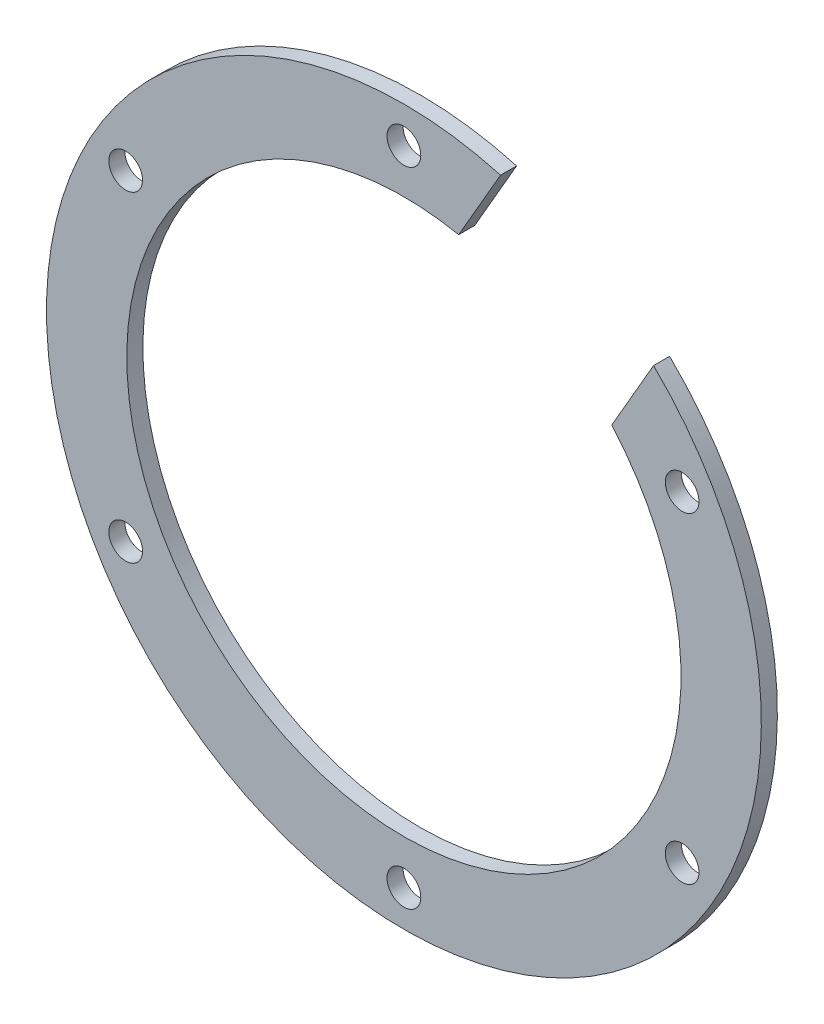
ISO-10303-21;
HEADER;
FILE_DESCRIPTION(('STEP AP214'),'2;1');
FILE_NAME('part.step','',(''),(''),'','','');
FILE_SCHEMA(('AUTOMOTIVE_DESIGN { 1 0 10303 214 1 1 1 1 }'));
ENDSEC;
DATA;
#1=APPLICATION_CONTEXT('core data for automotive mechanical design processes');
#2=APPLICATION_PROTOCOL_DEFINITION('international standard','automotive_design',2000,#1);
#3=PRODUCT_CONTEXT('',#1,'mechanical');
#4=PRODUCT('Part','Part','',(#3));
#5=PRODUCT_RELATED_PRODUCT_CATEGORY('part','',(#4));
#6=PRODUCT_DEFINITION_FORMATION('','',#4);
#7=PRODUCT_DEFINITION_CONTEXT('part definition',#1,'design');
#8=PRODUCT_DEFINITION('design','',#6,#7);
#9=PRODUCT_DEFINITION_SHAPE('','',#8);
#10=(LENGTH_UNIT() NAMED_UNIT(*) SI_UNIT(.MILLI.,.METRE.));
#11=(NAMED_UNIT(*) PLANE_ANGLE_UNIT() SI_UNIT($,.RADIAN.));
#12=(NAMED_UNIT(*) SI_UNIT($,.STERADIAN.) SOLID_ANGLE_UNIT());
#13=UNCERTAINTY_MEASURE_WITH_UNIT(LENGTH_MEASURE(1.E-05),#10,'distance_accuracy_value','');
#14=(GEOMETRIC_REPRESENTATION_CONTEXT(3) GLOBAL_UNCERTAINTY_ASSIGNED_CONTEXT((#13)) GLOBAL_UNIT_ASSIGNED_CONTEXT((#10,
#11,#12)) REPRESENTATION_CONTEXT('',''));
#15=CARTESIAN_POINT('',(0.,0.,0.));
#16=DIRECTION('',(0.,0.,1.));
#17=DIRECTION('',(1.,0.,0.));
#18=AXIS2_PLACEMENT_3D('',#15,#16,#17);
#19=CARTESIAN_POINT('',(0.,0.,2.));
#20=DIRECTION('',(0.,0.,1.));
#21=DIRECTION('',(1.,0.,0.));
#22=AXIS2_PLACEMENT_3D('',#19,#20,#21);
#23=PLANE('',#22);
#24=DIRECTION('',(-0.499999999999995,-0.866025403784442,0.));
#25=VECTOR('',#24,1.);
#26=CARTESIAN_POINT('',(-6.05603958406258,11.5106317477555,2.));
#27=LINE('',#26,#25);
#28=CARTESIAN_POINT('',(12.0332312207213,42.8421678535139,2.));
#29=VERTEX_POINT('',#28);
#30=CARTESIAN_POINT('',(6.82341474511337,33.8185010196515,2.));
#31=VERTEX_POINT('',#30);
#32=EDGE_CURVE('E56',#29,#31,#27,.T.);
#33=ORIENTED_EDGE('',*,*,#32,.F.);
#34=CARTESIAN_POINT('',(0.,0.,2.));
#35=DIRECTION('',(0.,0.,1.));
#36=DIRECTION('',(1.,0.,0.));
#37=AXIS2_PLACEMENT_3D('',#34,#35,#36);
#38=CIRCLE('',#37,44.5);
#39=CARTESIAN_POINT('',(31.085790103979,31.842167853514,2.));
#40=VERTEX_POINT('',#39);
#41=EDGE_CURVE('E79',#29,#40,#38,.T.);
#42=ORIENTED_EDGE('',*,*,#41,.T.);
#43=DIRECTION('',(0.499999999999995,0.866025403784442,0.));
#44=VECTOR('',#43,1.);
#45=CARTESIAN_POINT('',(12.9965192991951,0.510631747755618,2.));
#46=LINE('',#45,#44);
#47=CARTESIAN_POINT('',(25.8759736283711,22.8185010196516,2.));
#48=VERTEX_POINT('',#47);
#49=EDGE_CURVE('E73',#48,#40,#46,.T.);
#50=ORIENTED_EDGE('',*,*,#49,.F.);
#51=CARTESIAN_POINT('',(0.,0.,2.));
#52=DIRECTION('',(0.,0.,1.));
#53=DIRECTION('',(1.,0.,0.));
#54=AXIS2_PLACEMENT_3D('',#51,#52,#53);
#55=CIRCLE('',#54,34.5);
#56=EDGE_CURVE('E84',#31,#48,#55,.T.);
#57=ORIENTED_EDGE('',*,*,#56,.F.);
#58=EDGE_LOOP('',(#33,#42,#50,#57));
#59=FACE_BOUND('',#58,.T.);
#60=CARTESIAN_POINT('',(0.,40.,2.));
#61=DIRECTION('',(0.,0.,1.));
#62=DIRECTION('',(1.,0.,0.));
#63=AXIS2_PLACEMENT_3D('',#60,#61,#62);
#64=CIRCLE('',#63,2.1);
#65=CARTESIAN_POINT('',(2.1,40.,2.));
#66=VERTEX_POINT('',#65);
#67=EDGE_CURVE('E104',#66,#66,#64,.T.);
#68=ORIENTED_EDGE('',*,*,#67,.F.);
#69=EDGE_LOOP('',(#68));
#70=FACE_BOUND('',#69,.T.);
#71=CARTESIAN_POINT('',(-34.6410161513767,19.9999999999985,2.));
#72=DIRECTION('',(0.,0.,1.));
#73=DIRECTION('',(1.,0.,0.));
#74=AXIS2_PLACEMENT_3D('',#71,#72,#73);
#75=CIRCLE('',#74,2.10000000000172);
#76=CARTESIAN_POINT('',(-32.541016151375,19.9999999999985,2.));
#77=VERTEX_POINT('',#76);
#78=EDGE_CURVE('E175',#77,#77,#75,.T.);
#79=ORIENTED_EDGE('',*,*,#78,.F.);
#80=EDGE_LOOP('',(#79));
#81=FACE_BOUND('',#80,.T.);
#82=CARTESIAN_POINT('',(-34.641016151375,-20.0000000000015,2.));
#83=DIRECTION('',(0.,0.,1.));
#84=DIRECTION('',(1.,0.,0.));
#85=AXIS2_PLACEMENT_3D('',#82,#83,#84);
#86=CIRCLE('',#85,2.10000000000322);
#87=CARTESIAN_POINT('',(-32.5410161513718,-20.0000000000015,2.));
#88=VERTEX_POINT('',#87);
#89=EDGE_CURVE('E96',#88,#88,#86,.T.);
#90=ORIENTED_EDGE('',*,*,#89,.F.);
#91=EDGE_LOOP('',(#90));
#92=FACE_BOUND('',#91,.T.);
#93=CARTESIAN_POINT('',(3.39590937005871E-12,-40.,2.));
#94=DIRECTION('',(0.,0.,1.));
#95=DIRECTION('',(1.,0.,0.));
#96=AXIS2_PLACEMENT_3D('',#93,#94,#95);
#97=CIRCLE('',#96,2.10000000000351);
#98=CARTESIAN_POINT('',(2.10000000000691,-40.,2.));
#99=VERTEX_POINT('',#98);
#100=EDGE_CURVE('E186',#99,#99,#97,.T.);
#101=ORIENTED_EDGE('',*,*,#100,.F.);
#102=EDGE_LOOP('',(#101));
#103=FACE_BOUND('',#102,.T.);
#104=CARTESIAN_POINT('',(34.6410161513801,-19.9999999999985,2.));
#105=DIRECTION('',(0.,0.,1.));
#106=DIRECTION('',(1.,0.,0.));
#107=AXIS2_PLACEMENT_3D('',#104,#105,#106);
#108=CIRCLE('',#107,2.10000000000219);
#109=CARTESIAN_POINT('',(36.7410161513823,-19.9999999999985,2.));
#110=VERTEX_POINT('',#109);
#111=EDGE_CURVE('E184',#110,#110,#108,.T.);
#112=ORIENTED_EDGE('',*,*,#111,.F.);
#113=EDGE_LOOP('',(#112));
#114=FACE_BOUND('',#113,.T.);
#115=CARTESIAN_POINT('',(34.6410161513784,20.0000000000015,2.));
#116=DIRECTION('',(0.,0.,1.));
#117=DIRECTION('',(1.,0.,0.));
#118=AXIS2_PLACEMENT_3D('',#115,#116,#117);
#119=CIRCLE('',#118,2.10000000000048);
#120=CARTESIAN_POINT('',(36.7410161513789,20.0000000000015,2.));
#121=VERTEX_POINT('',#120);
#122=EDGE_CURVE('E164',#121,#121,#119,.T.);
#123=ORIENTED_EDGE('',*,*,#122,.F.);
#124=EDGE_LOOP('',(#123));
#125=FACE_BOUND('',#124,.T.);
#126=ADVANCED_FACE('F34',(#59,#70,#81,#92,#103,#114,#125),#23,.T.);
#127=CARTESIAN_POINT('',(0.,0.,0.));
#128=DIRECTION('',(0.,0.,1.));
#129=DIRECTION('',(1.,0.,0.));
#130=AXIS2_PLACEMENT_3D('',#127,#128,#129);
#131=PLANE('',#130);
#132=CARTESIAN_POINT('',(0.,40.,0.));
#133=DIRECTION('',(0.,0.,1.));
#134=DIRECTION('',(1.,0.,0.));
#135=AXIS2_PLACEMENT_3D('',#132,#133,#134);
#136=CIRCLE('',#135,2.1);
#137=CARTESIAN_POINT('',(2.1,40.,0.));
#138=VERTEX_POINT('',#137);
#139=EDGE_CURVE('E93',#138,#138,#136,.T.);
#140=ORIENTED_EDGE('',*,*,#139,.T.);
#141=EDGE_LOOP('',(#140));
#142=FACE_BOUND('',#141,.T.);
#143=CARTESIAN_POINT('',(-34.6410161513767,19.9999999999985,0.));
#144=DIRECTION('',(0.,0.,1.));
#145=DIRECTION('',(1.,0.,0.));
#146=AXIS2_PLACEMENT_3D('',#143,#144,#145);
#147=CIRCLE('',#146,2.10000000000172);
#148=CARTESIAN_POINT('',(-32.541016151375,19.9999999999985,0.));
#149=VERTEX_POINT('',#148);
#150=EDGE_CURVE('E113',#149,#149,#147,.T.);
#151=ORIENTED_EDGE('',*,*,#150,.T.);
#152=EDGE_LOOP('',(#151));
#153=FACE_BOUND('',#152,.T.);
#154=CARTESIAN_POINT('',(-34.641016151375,-20.0000000000015,0.));
#155=DIRECTION('',(0.,0.,1.));
#156=DIRECTION('',(1.,0.,0.));
#157=AXIS2_PLACEMENT_3D('',#154,#155,#156);
#158=CIRCLE('',#157,2.10000000000322);
#159=CARTESIAN_POINT('',(-32.5410161513718,-20.0000000000015,0.));
#160=VERTEX_POINT('',#159);
#161=EDGE_CURVE('E110',#160,#160,#158,.T.);
#162=ORIENTED_EDGE('',*,*,#161,.T.);
#163=EDGE_LOOP('',(#162));
#164=FACE_BOUND('',#163,.T.);
#165=CARTESIAN_POINT('',(3.39590937005871E-12,-40.,0.));
#166=DIRECTION('',(0.,0.,1.));
#167=DIRECTION('',(1.,0.,0.));
#168=AXIS2_PLACEMENT_3D('',#165,#166,#167);
#169=CIRCLE('',#168,2.10000000000351);
#170=CARTESIAN_POINT('',(2.10000000000691,-40.,0.));
#171=VERTEX_POINT('',#170);
#172=EDGE_CURVE('E107',#171,#171,#169,.T.);
#173=ORIENTED_EDGE('',*,*,#172,.T.);
#174=EDGE_LOOP('',(#173));
#175=FACE_BOUND('',#174,.T.);
#176=CARTESIAN_POINT('',(34.6410161513801,-19.9999999999985,0.));
#177=DIRECTION('',(0.,0.,1.));
#178=DIRECTION('',(1.,0.,0.));
#179=AXIS2_PLACEMENT_3D('',#176,#177,#178);
#180=CIRCLE('',#179,2.10000000000219);
#181=CARTESIAN_POINT('',(36.7410161513823,-19.9999999999985,0.));
#182=VERTEX_POINT('',#181);
#183=EDGE_CURVE('E103',#182,#182,#180,.T.);
#184=ORIENTED_EDGE('',*,*,#183,.T.);
#185=EDGE_LOOP('',(#184));
#186=FACE_BOUND('',#185,.T.);
#187=CARTESIAN_POINT('',(34.6410161513784,20.0000000000015,0.));
#188=DIRECTION('',(0.,0.,1.));
#189=DIRECTION('',(1.,0.,0.));
#190=AXIS2_PLACEMENT_3D('',#187,#188,#189);
#191=CIRCLE('',#190,2.10000000000048);
#192=CARTESIAN_POINT('',(36.7410161513789,20.0000000000015,0.));
#193=VERTEX_POINT('',#192);
#194=EDGE_CURVE('E100',#193,#193,#191,.T.);
#195=ORIENTED_EDGE('',*,*,#194,.T.);
#196=EDGE_LOOP('',(#195));
#197=FACE_BOUND('',#196,.T.);
#198=CARTESIAN_POINT('',(0.,0.,0.));
#199=DIRECTION('',(0.,0.,1.));
#200=DIRECTION('',(1.,0.,0.));
#201=AXIS2_PLACEMENT_3D('',#198,#199,#200);
#202=CIRCLE('',#201,44.5);
#203=CARTESIAN_POINT('',(12.0332312207213,42.8421678535139,0.));
#204=VERTEX_POINT('',#203);
#205=CARTESIAN_POINT('',(31.085790103979,31.842167853514,0.));
#206=VERTEX_POINT('',#205);
#207=EDGE_CURVE('E88',#204,#206,#202,.T.);
#208=ORIENTED_EDGE('',*,*,#207,.F.);
#209=DIRECTION('',(-0.499999999999995,-0.866025403784442,0.));
#210=VECTOR('',#209,1.);
#211=CARTESIAN_POINT('',(-9.5262794416289,5.49999999999997,0.));
#212=LINE('',#211,#210);
#213=CARTESIAN_POINT('',(6.82341474511337,33.8185010196515,0.));
#214=VERTEX_POINT('',#213);
#215=EDGE_CURVE('E170',#204,#214,#212,.T.);
#216=ORIENTED_EDGE('',*,*,#215,.T.);
#217=CARTESIAN_POINT('',(0.,0.,0.));
#218=DIRECTION('',(0.,0.,1.));
#219=DIRECTION('',(1.,0.,0.));
#220=AXIS2_PLACEMENT_3D('',#217,#218,#219);
#221=CIRCLE('',#220,34.5);
#222=CARTESIAN_POINT('',(25.8759736283711,22.8185010196516,0.));
#223=VERTEX_POINT('',#222);
#224=EDGE_CURVE('E89',#214,#223,#221,.T.);
#225=ORIENTED_EDGE('',*,*,#224,.T.);
#226=DIRECTION('',(0.499999999999995,0.866025403784442,0.));
#227=VECTOR('',#226,1.);
#228=CARTESIAN_POINT('',(9.52627944162881,-5.49999999999992,0.));
#229=LINE('',#228,#227);
#230=EDGE_CURVE('E49',#223,#206,#229,.T.);
#231=ORIENTED_EDGE('',*,*,#230,.T.);
#232=EDGE_LOOP('',(#208,#216,#225,#231));
#233=FACE_BOUND('',#232,.T.);
#234=ADVANCED_FACE('F119',(#142,#153,#164,#175,#186,#197,#233),#131,.F.);
#235=CARTESIAN_POINT('',(0.,0.,2.));
#236=DIRECTION('',(0.,0.,-1.));
#237=DIRECTION('',(-1.,0.,0.));
#238=AXIS2_PLACEMENT_3D('',#235,#236,#237);
#239=CYLINDRICAL_SURFACE('',#238,44.5);
#240=ORIENTED_EDGE('',*,*,#41,.F.);
#241=DIRECTION('',(0.,0.,-1.));
#242=VECTOR('',#241,1.);
#243=CARTESIAN_POINT('',(12.0332312207213,42.8421678535139,2.));
#244=LINE('',#243,#242);
#245=EDGE_CURVE('E174',#29,#204,#244,.T.);
#246=ORIENTED_EDGE('',*,*,#245,.T.);
#247=ORIENTED_EDGE('',*,*,#207,.T.);
#248=DIRECTION('',(0.,0.,-1.));
#249=VECTOR('',#248,1.);
#250=CARTESIAN_POINT('',(31.085790103979,31.842167853514,2.));
#251=LINE('',#250,#249);
#252=EDGE_CURVE('E173',#206,#40,#251,.F.);
#253=ORIENTED_EDGE('',*,*,#252,.T.);
#254=EDGE_LOOP('',(#240,#246,#247,#253));
#255=FACE_BOUND('',#254,.T.);
#256=ADVANCED_FACE('F36',(#255),#239,.T.);
#257=CARTESIAN_POINT('',(0.,0.,2.));
#258=DIRECTION('',(0.,0.,-1.));
#259=DIRECTION('',(-1.,0.,0.));
#260=AXIS2_PLACEMENT_3D('',#257,#258,#259);
#261=CYLINDRICAL_SURFACE('',#260,34.5);
#262=DIRECTION('',(0.,0.,-1.));
#263=VECTOR('',#262,1.);
#264=CARTESIAN_POINT('',(6.82341474511337,33.8185010196515,2.));
#265=LINE('',#264,#263);
#266=EDGE_CURVE('E11',#31,#214,#265,.T.);
#267=ORIENTED_EDGE('',*,*,#266,.F.);
#268=ORIENTED_EDGE('',*,*,#56,.T.);
#269=DIRECTION('',(0.,0.,-1.));
#270=VECTOR('',#269,1.);
#271=CARTESIAN_POINT('',(25.8759736283711,22.8185010196516,2.));
#272=LINE('',#271,#270);
#273=EDGE_CURVE('E42',#223,#48,#272,.F.);
#274=ORIENTED_EDGE('',*,*,#273,.F.);
#275=ORIENTED_EDGE('',*,*,#224,.F.);
#276=EDGE_LOOP('',(#267,#268,#274,#275));
#277=FACE_BOUND('',#276,.T.);
#278=ADVANCED_FACE('F87',(#277),#261,.F.);
#279=CARTESIAN_POINT('',(34.6410161513784,20.0000000000015,-24.));
#280=DIRECTION('',(0.,0.,1.));
#281=DIRECTION('',(1.,0.,0.));
#282=AXIS2_PLACEMENT_3D('',#279,#280,#281);
#283=CYLINDRICAL_SURFACE('',#282,2.10000000000048);
#284=CARTESIAN_POINT('',(36.7410161513789,20.0000000000015,2.));
#285=CARTESIAN_POINT('',(36.7410161513789,20.0000000000015,1.97916666666667));
#286=CARTESIAN_POINT('',(36.7410161513789,20.0000000000015,1.95833333333333));
#287=CARTESIAN_POINT('',(36.7410161513789,20.0000000000015,1.91666666666666));
#288=CARTESIAN_POINT('',(36.7410161513789,20.0000000000015,1.89583333333333));
#289=CARTESIAN_POINT('',(36.7410161513789,20.0000000000015,1.85416666666666));
#290=CARTESIAN_POINT('',(36.7410161513789,20.0000000000015,1.83333333333333));
#291=CARTESIAN_POINT('',(36.7410161513789,20.0000000000015,1.79166666666666));
#292=CARTESIAN_POINT('',(36.7410161513789,20.0000000000015,1.77083333333333));
#293=CARTESIAN_POINT('',(36.7410161513789,20.0000000000015,1.72916666666666));
#294=CARTESIAN_POINT('',(36.7410161513789,20.0000000000015,1.70833333333333));
#295=CARTESIAN_POINT('',(36.7410161513789,20.0000000000015,1.66666666666666));
#296=CARTESIAN_POINT('',(36.7410161513789,20.0000000000015,1.64583333333333));
#297=CARTESIAN_POINT('',(36.7410161513789,20.0000000000015,1.60416666666666));
#298=CARTESIAN_POINT('',(36.7410161513789,20.0000000000015,1.58333333333333));
#299=CARTESIAN_POINT('',(36.7410161513789,20.0000000000015,1.54166666666666));
#300=CARTESIAN_POINT('',(36.7410161513789,20.0000000000015,1.52083333333333));
#301=CARTESIAN_POINT('',(36.7410161513789,20.0000000000015,1.47916666666666));
#302=CARTESIAN_POINT('',(36.7410161513789,20.0000000000015,1.45833333333333));
#303=CARTESIAN_POINT('',(36.7410161513789,20.0000000000015,1.41666666666666));
#304=CARTESIAN_POINT('',(36.7410161513789,20.0000000000015,1.39583333333333));
#305=CARTESIAN_POINT('',(36.7410161513789,20.0000000000015,1.35416666666666));
#306=CARTESIAN_POINT('',(36.7410161513789,20.0000000000015,1.33333333333333));
#307=CARTESIAN_POINT('',(36.7410161513789,20.0000000000015,1.29166666666666));
#308=CARTESIAN_POINT('',(36.7410161513789,20.0000000000015,1.27083333333333));
#309=CARTESIAN_POINT('',(36.7410161513789,20.0000000000015,1.22916666666666));
#310=CARTESIAN_POINT('',(36.7410161513789,20.0000000000015,1.20833333333333));
#311=CARTESIAN_POINT('',(36.7410161513789,20.0000000000015,1.16666666666666));
#312=CARTESIAN_POINT('',(36.7410161513789,20.0000000000015,1.14583333333333));
#313=CARTESIAN_POINT('',(36.7410161513789,20.0000000000015,1.10416666666666));
#314=CARTESIAN_POINT('',(36.7410161513789,20.0000000000015,1.08333333333333));
#315=CARTESIAN_POINT('',(36.7410161513789,20.0000000000015,1.04166666666666));
#316=CARTESIAN_POINT('',(36.7410161513789,20.0000000000015,1.02083333333333));
#317=CARTESIAN_POINT('',(36.7410161513789,20.0000000000015,0.979166666666664));
#318=CARTESIAN_POINT('',(36.7410161513789,20.0000000000015,0.958333333333331));
#319=CARTESIAN_POINT('',(36.7410161513789,20.0000000000015,0.916666666666664));
#320=CARTESIAN_POINT('',(36.7410161513789,20.0000000000015,0.895833333333331));
#321=CARTESIAN_POINT('',(36.7410161513789,20.0000000000015,0.854166666666664));
#322=CARTESIAN_POINT('',(36.7410161513789,20.0000000000015,0.833333333333331));
#323=CARTESIAN_POINT('',(36.7410161513789,20.0000000000015,0.791666666666664));
#324=CARTESIAN_POINT('',(36.7410161513789,20.0000000000015,0.77083333333333));
#325=CARTESIAN_POINT('',(36.7410161513789,20.0000000000015,0.729166666666664));
#326=CARTESIAN_POINT('',(36.7410161513789,20.0000000000015,0.70833333333333));
#327=CARTESIAN_POINT('',(36.7410161513789,20.0000000000015,0.666666666666664));
#328=CARTESIAN_POINT('',(36.7410161513789,20.0000000000015,0.64583333333333));
#329=CARTESIAN_POINT('',(36.7410161513789,20.0000000000015,0.604166666666664));
#330=CARTESIAN_POINT('',(36.7410161513789,20.0000000000015,0.58333333333333));
#331=CARTESIAN_POINT('',(36.7410161513789,20.0000000000015,0.541666666666664));
#332=CARTESIAN_POINT('',(36.7410161513789,20.0000000000015,0.52083333333333));
#333=CARTESIAN_POINT('',(36.7410161513789,20.0000000000015,0.479166666666664));
#334=CARTESIAN_POINT('',(36.7410161513789,20.0000000000015,0.45833333333333));
#335=CARTESIAN_POINT('',(36.7410161513789,20.0000000000015,0.416666666666664));
#336=CARTESIAN_POINT('',(36.7410161513789,20.0000000000015,0.39583333333333));
#337=CARTESIAN_POINT('',(36.7410161513789,20.0000000000015,0.354166666666664));
#338=CARTESIAN_POINT('',(36.7410161513789,20.0000000000015,0.33333333333333));
#339=CARTESIAN_POINT('',(36.7410161513789,20.0000000000015,0.291666666666663));
#340=CARTESIAN_POINT('',(36.7410161513789,20.0000000000015,0.27083333333333));
#341=CARTESIAN_POINT('',(36.7410161513789,20.0000000000015,0.229166666666663));
#342=CARTESIAN_POINT('',(36.7410161513789,20.0000000000015,0.20833333333333));
#343=CARTESIAN_POINT('',(36.7410161513789,20.0000000000015,0.166666666666663));
#344=CARTESIAN_POINT('',(36.7410161513789,20.0000000000015,0.14583333333333));
#345=CARTESIAN_POINT('',(36.7410161513789,20.0000000000015,0.104166666666663));
#346=CARTESIAN_POINT('',(36.7410161513789,20.0000000000015,0.0833333333333299));
#347=CARTESIAN_POINT('',(36.7410161513789,20.0000000000015,0.0416666666666632));
#348=CARTESIAN_POINT('',(36.7410161513789,20.0000000000015,0.0208333333333299));
#349=CARTESIAN_POINT('',(36.7410161513789,20.0000000000015,0.));
#350=B_SPLINE_CURVE_WITH_KNOTS('',3,(#284,#285,#286,#287,#288,#289,#290,#291,#292,#293,#294,
#295,#296,#297,#298,#299,#300,#301,#302,#303,#304,#305,#306,#307,#308,#309,#310,#311,#312,#313,
#314,#315,#316,#317,#318,#319,#320,#321,#322,#323,#324,#325,#326,#327,#328,#329,#330,#331,#332,
#333,#334,#335,#336,#337,#338,#339,#340,#341,#342,#343,#344,#345,#346,#347,#348,#349),
.UNSPECIFIED.,.F.,.F.,(4,2,2,2,2,2,2,2,2,2,2,2,2,2,2,2,2,2,2,2,2,2,2,2,2,2,2,2,2,2,2,2,4),(0.,
0.0625000000000001,0.125,0.1875,0.25,0.3125,0.375,0.4375,0.5,0.5625,0.625000000000001,
0.687500000000001,0.750000000000001,0.812500000000001,0.875000000000001,0.937500000000001,1.,
1.0625,1.125,1.1875,1.25,1.3125,1.375,1.4375,1.5,1.5625,1.625,1.6875,1.75,1.8125,1.875,1.9375,
2.),.UNSPECIFIED.);
#351=EDGE_CURVE('BSEAM145',#121,#193,#350,.T.);
#352=ORIENTED_EDGE('',*,*,#122,.T.);
#353=ORIENTED_EDGE('',*,*,#194,.F.);
#354=ORIENTED_EDGE('',*,*,#351,.T.);
#355=ORIENTED_EDGE('',*,*,#351,.F.);
#356=EDGE_LOOP('',(#352,#354,#353,#355));
#357=FACE_BOUND('',#356,.T.);
#358=ADVANCED_FACE('F145',(#357),#283,.F.);
#359=CARTESIAN_POINT('',(34.6410161513801,-19.9999999999985,-24.));
#360=DIRECTION('',(0.,0.,1.));
#361=DIRECTION('',(1.,0.,0.));
#362=AXIS2_PLACEMENT_3D('',#359,#360,#361);
#363=CYLINDRICAL_SURFACE('',#362,2.10000000000219);
#364=CARTESIAN_POINT('',(36.7410161513823,-19.9999999999985,2.));
#365=CARTESIAN_POINT('',(36.7410161513823,-19.9999999999985,1.97916666666667));
#366=CARTESIAN_POINT('',(36.7410161513823,-19.9999999999985,1.95833333333333));
#367=CARTESIAN_POINT('',(36.7410161513823,-19.9999999999985,1.91666666666666));
#368=CARTESIAN_POINT('',(36.7410161513823,-19.9999999999985,1.89583333333333));
#369=CARTESIAN_POINT('',(36.7410161513823,-19.9999999999985,1.85416666666666));
#370=CARTESIAN_POINT('',(36.7410161513823,-19.9999999999985,1.83333333333333));
#371=CARTESIAN_POINT('',(36.7410161513823,-19.9999999999985,1.79166666666666));
#372=CARTESIAN_POINT('',(36.7410161513823,-19.9999999999985,1.77083333333333));
#373=CARTESIAN_POINT('',(36.7410161513823,-19.9999999999985,1.72916666666666));
#374=CARTESIAN_POINT('',(36.7410161513823,-19.9999999999985,1.70833333333333));
#375=CARTESIAN_POINT('',(36.7410161513823,-19.9999999999985,1.66666666666666));
#376=CARTESIAN_POINT('',(36.7410161513823,-19.9999999999985,1.64583333333333));
#377=CARTESIAN_POINT('',(36.7410161513823,-19.9999999999985,1.60416666666666));
#378=CARTESIAN_POINT('',(36.7410161513823,-19.9999999999985,1.58333333333333));
#379=CARTESIAN_POINT('',(36.7410161513823,-19.9999999999985,1.54166666666666));
#380=CARTESIAN_POINT('',(36.7410161513823,-19.9999999999985,1.52083333333333));
#381=CARTESIAN_POINT('',(36.7410161513823,-19.9999999999985,1.47916666666666));
#382=CARTESIAN_POINT('',(36.7410161513823,-19.9999999999985,1.45833333333333));
#383=CARTESIAN_POINT('',(36.7410161513823,-19.9999999999985,1.41666666666666));
#384=CARTESIAN_POINT('',(36.7410161513823,-19.9999999999985,1.39583333333333));
#385=CARTESIAN_POINT('',(36.7410161513823,-19.9999999999985,1.35416666666666));
#386=CARTESIAN_POINT('',(36.7410161513823,-19.9999999999985,1.33333333333333));
#387=CARTESIAN_POINT('',(36.7410161513823,-19.9999999999985,1.29166666666666));
#388=CARTESIAN_POINT('',(36.7410161513823,-19.9999999999985,1.27083333333333));
#389=CARTESIAN_POINT('',(36.7410161513823,-19.9999999999985,1.22916666666666));
#390=CARTESIAN_POINT('',(36.7410161513823,-19.9999999999985,1.20833333333333));
#391=CARTESIAN_POINT('',(36.7410161513823,-19.9999999999985,1.16666666666666));
#392=CARTESIAN_POINT('',(36.7410161513823,-19.9999999999985,1.14583333333333));
#393=CARTESIAN_POINT('',(36.7410161513823,-19.9999999999985,1.10416666666666));
#394=CARTESIAN_POINT('',(36.7410161513823,-19.9999999999985,1.08333333333333));
#395=CARTESIAN_POINT('',(36.7410161513823,-19.9999999999985,1.04166666666666));
#396=CARTESIAN_POINT('',(36.7410161513823,-19.9999999999985,1.02083333333333));
#397=CARTESIAN_POINT('',(36.7410161513823,-19.9999999999985,0.979166666666664));
#398=CARTESIAN_POINT('',(36.7410161513823,-19.9999999999985,0.958333333333331));
#399=CARTESIAN_POINT('',(36.7410161513823,-19.9999999999985,0.916666666666664));
#400=CARTESIAN_POINT('',(36.7410161513823,-19.9999999999985,0.895833333333331));
#401=CARTESIAN_POINT('',(36.7410161513823,-19.9999999999985,0.854166666666664));
#402=CARTESIAN_POINT('',(36.7410161513823,-19.9999999999985,0.833333333333331));
#403=CARTESIAN_POINT('',(36.7410161513823,-19.9999999999985,0.791666666666664));
#404=CARTESIAN_POINT('',(36.7410161513823,-19.9999999999985,0.77083333333333));
#405=CARTESIAN_POINT('',(36.7410161513823,-19.9999999999985,0.729166666666664));
#406=CARTESIAN_POINT('',(36.7410161513823,-19.9999999999985,0.70833333333333));
#407=CARTESIAN_POINT('',(36.7410161513823,-19.9999999999985,0.666666666666664));
#408=CARTESIAN_POINT('',(36.7410161513823,-19.9999999999985,0.64583333333333));
#409=CARTESIAN_POINT('',(36.7410161513823,-19.9999999999985,0.604166666666664));
#410=CARTESIAN_POINT('',(36.7410161513823,-19.9999999999985,0.58333333333333));
#411=CARTESIAN_POINT('',(36.7410161513823,-19.9999999999985,0.541666666666664));
#412=CARTESIAN_POINT('',(36.7410161513823,-19.9999999999985,0.52083333333333));
#413=CARTESIAN_POINT('',(36.7410161513823,-19.9999999999985,0.479166666666664));
#414=CARTESIAN_POINT('',(36.7410161513823,-19.9999999999985,0.45833333333333));
#415=CARTESIAN_POINT('',(36.7410161513823,-19.9999999999985,0.416666666666664));
#416=CARTESIAN_POINT('',(36.7410161513823,-19.9999999999985,0.39583333333333));
#417=CARTESIAN_POINT('',(36.7410161513823,-19.9999999999985,0.354166666666664));
#418=CARTESIAN_POINT('',(36.7410161513823,-19.9999999999985,0.33333333333333));
#419=CARTESIAN_POINT('',(36.7410161513823,-19.9999999999985,0.291666666666663));
#420=CARTESIAN_POINT('',(36.7410161513823,-19.9999999999985,0.27083333333333));
#421=CARTESIAN_POINT('',(36.7410161513823,-19.9999999999985,0.229166666666663));
#422=CARTESIAN_POINT('',(36.7410161513823,-19.9999999999985,0.20833333333333));
#423=CARTESIAN_POINT('',(36.7410161513823,-19.9999999999985,0.166666666666663));
#424=CARTESIAN_POINT('',(36.7410161513823,-19.9999999999985,0.14583333333333));
#425=CARTESIAN_POINT('',(36.7410161513823,-19.9999999999985,0.104166666666663));
#426=CARTESIAN_POINT('',(36.7410161513823,-19.9999999999985,0.0833333333333299));
#427=CARTESIAN_POINT('',(36.7410161513823,-19.9999999999985,0.0416666666666632));
#428=CARTESIAN_POINT('',(36.7410161513823,-19.9999999999985,0.0208333333333299));
#429=CARTESIAN_POINT('',(36.7410161513823,-19.9999999999985,0.));
#430=B_SPLINE_CURVE_WITH_KNOTS('',3,(#364,#365,#366,#367,#368,#369,#370,#371,#372,#373,#374,
#375,#376,#377,#378,#379,#380,#381,#382,#383,#384,#385,#386,#387,#388,#389,#390,#391,#392,#393,
#394,#395,#396,#397,#398,#399,#400,#401,#402,#403,#404,#405,#406,#407,#408,#409,#410,#411,#412,
#413,#414,#415,#416,#417,#418,#419,#420,#421,#422,#423,#424,#425,#426,#427,#428,#429),
.UNSPECIFIED.,.F.,.F.,(4,2,2,2,2,2,2,2,2,2,2,2,2,2,2,2,2,2,2,2,2,2,2,2,2,2,2,2,2,2,2,2,4),(0.,
0.0625000000000001,0.125,0.1875,0.25,0.3125,0.375,0.4375,0.5,0.5625,0.625000000000001,
0.687500000000001,0.750000000000001,0.812500000000001,0.875000000000001,0.937500000000001,1.,
1.0625,1.125,1.1875,1.25,1.3125,1.375,1.4375,1.5,1.5625,1.625,1.6875,1.75,1.8125,1.875,1.9375,
2.),.UNSPECIFIED.);
#431=EDGE_CURVE('BSEAM152',#110,#182,#430,.T.);
#432=ORIENTED_EDGE('',*,*,#111,.T.);
#433=ORIENTED_EDGE('',*,*,#183,.F.);
#434=ORIENTED_EDGE('',*,*,#431,.T.);
#435=ORIENTED_EDGE('',*,*,#431,.F.);
#436=EDGE_LOOP('',(#432,#434,#433,#435));
#437=FACE_BOUND('',#436,.T.);
#438=ADVANCED_FACE('F152',(#437),#363,.F.);
#439=CARTESIAN_POINT('',(3.39590937005871E-12,-40.,-24.));
#440=DIRECTION('',(0.,0.,1.));
#441=DIRECTION('',(1.,0.,0.));
#442=AXIS2_PLACEMENT_3D('',#439,#440,#441);
#443=CYLINDRICAL_SURFACE('',#442,2.10000000000351);
#444=CARTESIAN_POINT('',(2.10000000000691,-40.,2.));
#445=CARTESIAN_POINT('',(2.10000000000691,-40.,1.97916666666667));
#446=CARTESIAN_POINT('',(2.10000000000691,-40.,1.95833333333333));
#447=CARTESIAN_POINT('',(2.10000000000691,-40.,1.91666666666666));
#448=CARTESIAN_POINT('',(2.10000000000691,-40.,1.89583333333333));
#449=CARTESIAN_POINT('',(2.10000000000691,-40.,1.85416666666666));
#450=CARTESIAN_POINT('',(2.10000000000691,-40.,1.83333333333333));
#451=CARTESIAN_POINT('',(2.10000000000691,-40.,1.79166666666666));
#452=CARTESIAN_POINT('',(2.10000000000691,-40.,1.77083333333333));
#453=CARTESIAN_POINT('',(2.10000000000691,-40.,1.72916666666666));
#454=CARTESIAN_POINT('',(2.10000000000691,-40.,1.70833333333333));
#455=CARTESIAN_POINT('',(2.10000000000691,-40.,1.66666666666666));
#456=CARTESIAN_POINT('',(2.10000000000691,-40.,1.64583333333333));
#457=CARTESIAN_POINT('',(2.10000000000691,-40.,1.60416666666666));
#458=CARTESIAN_POINT('',(2.10000000000691,-40.,1.58333333333333));
#459=CARTESIAN_POINT('',(2.10000000000691,-40.,1.54166666666666));
#460=CARTESIAN_POINT('',(2.10000000000691,-40.,1.52083333333333));
#461=CARTESIAN_POINT('',(2.10000000000691,-40.,1.47916666666666));
#462=CARTESIAN_POINT('',(2.10000000000691,-40.,1.45833333333333));
#463=CARTESIAN_POINT('',(2.10000000000691,-40.,1.41666666666666));
#464=CARTESIAN_POINT('',(2.10000000000691,-40.,1.39583333333333));
#465=CARTESIAN_POINT('',(2.10000000000691,-40.,1.35416666666666));
#466=CARTESIAN_POINT('',(2.10000000000691,-40.,1.33333333333333));
#467=CARTESIAN_POINT('',(2.10000000000691,-40.,1.29166666666666));
#468=CARTESIAN_POINT('',(2.10000000000691,-40.,1.27083333333333));
#469=CARTESIAN_POINT('',(2.10000000000691,-40.,1.22916666666666));
#470=CARTESIAN_POINT('',(2.10000000000691,-40.,1.20833333333333));
#471=CARTESIAN_POINT('',(2.10000000000691,-40.,1.16666666666666));
#472=CARTESIAN_POINT('',(2.10000000000691,-40.,1.14583333333333));
#473=CARTESIAN_POINT('',(2.10000000000691,-40.,1.10416666666666));
#474=CARTESIAN_POINT('',(2.10000000000691,-40.,1.08333333333333));
#475=CARTESIAN_POINT('',(2.10000000000691,-40.,1.04166666666666));
#476=CARTESIAN_POINT('',(2.10000000000691,-40.,1.02083333333333));
#477=CARTESIAN_POINT('',(2.10000000000691,-40.,0.979166666666664));
#478=CARTESIAN_POINT('',(2.10000000000691,-40.,0.958333333333331));
#479=CARTESIAN_POINT('',(2.10000000000691,-40.,0.916666666666664));
#480=CARTESIAN_POINT('',(2.10000000000691,-40.,0.895833333333331));
#481=CARTESIAN_POINT('',(2.10000000000691,-40.,0.854166666666664));
#482=CARTESIAN_POINT('',(2.10000000000691,-40.,0.833333333333331));
#483=CARTESIAN_POINT('',(2.10000000000691,-40.,0.791666666666664));
#484=CARTESIAN_POINT('',(2.10000000000691,-40.,0.77083333333333));
#485=CARTESIAN_POINT('',(2.10000000000691,-40.,0.729166666666664));
#486=CARTESIAN_POINT('',(2.10000000000691,-40.,0.70833333333333));
#487=CARTESIAN_POINT('',(2.10000000000691,-40.,0.666666666666664));
#488=CARTESIAN_POINT('',(2.10000000000691,-40.,0.64583333333333));
#489=CARTESIAN_POINT('',(2.10000000000691,-40.,0.604166666666664));
#490=CARTESIAN_POINT('',(2.10000000000691,-40.,0.58333333333333));
#491=CARTESIAN_POINT('',(2.10000000000691,-40.,0.541666666666664));
#492=CARTESIAN_POINT('',(2.10000000000691,-40.,0.52083333333333));
#493=CARTESIAN_POINT('',(2.10000000000691,-40.,0.479166666666664));
#494=CARTESIAN_POINT('',(2.10000000000691,-40.,0.45833333333333));
#495=CARTESIAN_POINT('',(2.10000000000691,-40.,0.416666666666664));
#496=CARTESIAN_POINT('',(2.10000000000691,-40.,0.39583333333333));
#497=CARTESIAN_POINT('',(2.10000000000691,-40.,0.354166666666664));
#498=CARTESIAN_POINT('',(2.10000000000691,-40.,0.33333333333333));
#499=CARTESIAN_POINT('',(2.10000000000691,-40.,0.291666666666663));
#500=CARTESIAN_POINT('',(2.10000000000691,-40.,0.27083333333333));
#501=CARTESIAN_POINT('',(2.10000000000691,-40.,0.229166666666663));
#502=CARTESIAN_POINT('',(2.10000000000691,-40.,0.20833333333333));
#503=CARTESIAN_POINT('',(2.10000000000691,-40.,0.166666666666663));
#504=CARTESIAN_POINT('',(2.10000000000691,-40.,0.14583333333333));
#505=CARTESIAN_POINT('',(2.10000000000691,-40.,0.104166666666663));
#506=CARTESIAN_POINT('',(2.10000000000691,-40.,0.0833333333333299));
#507=CARTESIAN_POINT('',(2.10000000000691,-40.,0.0416666666666632));
#508=CARTESIAN_POINT('',(2.10000000000691,-40.,0.0208333333333299));
#509=CARTESIAN_POINT('',(2.10000000000691,-40.,0.));
#510=B_SPLINE_CURVE_WITH_KNOTS('',3,(#444,#445,#446,#447,#448,#449,#450,#451,#452,#453,#454,
#455,#456,#457,#458,#459,#460,#461,#462,#463,#464,#465,#466,#467,#468,#469,#470,#471,#472,#473,
#474,#475,#476,#477,#478,#479,#480,#481,#482,#483,#484,#485,#486,#487,#488,#489,#490,#491,#492,
#493,#494,#495,#496,#497,#498,#499,#500,#501,#502,#503,#504,#505,#506,#507,#508,#509),
.UNSPECIFIED.,.F.,.F.,(4,2,2,2,2,2,2,2,2,2,2,2,2,2,2,2,2,2,2,2,2,2,2,2,2,2,2,2,2,2,2,2,4),(0.,
0.0625000000000001,0.125,0.1875,0.25,0.3125,0.375,0.4375,0.5,0.5625,0.625000000000001,
0.687500000000001,0.750000000000001,0.812500000000001,0.875000000000001,0.937500000000001,1.,
1.0625,1.125,1.1875,1.25,1.3125,1.375,1.4375,1.5,1.5625,1.625,1.6875,1.75,1.8125,1.875,1.9375,
2.),.UNSPECIFIED.);
#511=EDGE_CURVE('BSEAM148',#99,#171,#510,.T.);
#512=ORIENTED_EDGE('',*,*,#100,.T.);
#513=ORIENTED_EDGE('',*,*,#172,.F.);
#514=ORIENTED_EDGE('',*,*,#511,.T.);
#515=ORIENTED_EDGE('',*,*,#511,.F.);
#516=EDGE_LOOP('',(#512,#514,#513,#515));
#517=FACE_BOUND('',#516,.T.);
#518=ADVANCED_FACE('F148',(#517),#443,.F.);
#519=CARTESIAN_POINT('',(-34.641016151375,-20.0000000000015,-24.));
#520=DIRECTION('',(0.,0.,1.));
#521=DIRECTION('',(1.,0.,0.));
#522=AXIS2_PLACEMENT_3D('',#519,#520,#521);
#523=CYLINDRICAL_SURFACE('',#522,2.10000000000322);
#524=CARTESIAN_POINT('',(-32.5410161513718,-20.0000000000015,2.));
#525=CARTESIAN_POINT('',(-32.5410161513718,-20.0000000000015,1.97916666666667));
#526=CARTESIAN_POINT('',(-32.5410161513718,-20.0000000000015,1.95833333333333));
#527=CARTESIAN_POINT('',(-32.5410161513718,-20.0000000000015,1.91666666666666));
#528=CARTESIAN_POINT('',(-32.5410161513718,-20.0000000000015,1.89583333333333));
#529=CARTESIAN_POINT('',(-32.5410161513718,-20.0000000000015,1.85416666666666));
#530=CARTESIAN_POINT('',(-32.5410161513718,-20.0000000000015,1.83333333333333));
#531=CARTESIAN_POINT('',(-32.5410161513718,-20.0000000000015,1.79166666666666));
#532=CARTESIAN_POINT('',(-32.5410161513718,-20.0000000000015,1.77083333333333));
#533=CARTESIAN_POINT('',(-32.5410161513718,-20.0000000000015,1.72916666666666));
#534=CARTESIAN_POINT('',(-32.5410161513718,-20.0000000000015,1.70833333333333));
#535=CARTESIAN_POINT('',(-32.5410161513718,-20.0000000000015,1.66666666666666));
#536=CARTESIAN_POINT('',(-32.5410161513718,-20.0000000000015,1.64583333333333));
#537=CARTESIAN_POINT('',(-32.5410161513718,-20.0000000000015,1.60416666666666));
#538=CARTESIAN_POINT('',(-32.5410161513718,-20.0000000000015,1.58333333333333));
#539=CARTESIAN_POINT('',(-32.5410161513718,-20.0000000000015,1.54166666666666));
#540=CARTESIAN_POINT('',(-32.5410161513718,-20.0000000000015,1.52083333333333));
#541=CARTESIAN_POINT('',(-32.5410161513718,-20.0000000000015,1.47916666666666));
#542=CARTESIAN_POINT('',(-32.5410161513718,-20.0000000000015,1.45833333333333));
#543=CARTESIAN_POINT('',(-32.5410161513718,-20.0000000000015,1.41666666666666));
#544=CARTESIAN_POINT('',(-32.5410161513718,-20.0000000000015,1.39583333333333));
#545=CARTESIAN_POINT('',(-32.5410161513718,-20.0000000000015,1.35416666666666));
#546=CARTESIAN_POINT('',(-32.5410161513718,-20.0000000000015,1.33333333333333));
#547=CARTESIAN_POINT('',(-32.5410161513718,-20.0000000000015,1.29166666666666));
#548=CARTESIAN_POINT('',(-32.5410161513718,-20.0000000000015,1.27083333333333));
#549=CARTESIAN_POINT('',(-32.5410161513718,-20.0000000000015,1.22916666666666));
#550=CARTESIAN_POINT('',(-32.5410161513718,-20.0000000000015,1.20833333333333));
#551=CARTESIAN_POINT('',(-32.5410161513718,-20.0000000000015,1.16666666666666));
#552=CARTESIAN_POINT('',(-32.5410161513718,-20.0000000000015,1.14583333333333));
#553=CARTESIAN_POINT('',(-32.5410161513718,-20.0000000000015,1.10416666666666));
#554=CARTESIAN_POINT('',(-32.5410161513718,-20.0000000000015,1.08333333333333));
#555=CARTESIAN_POINT('',(-32.5410161513718,-20.0000000000015,1.04166666666666));
#556=CARTESIAN_POINT('',(-32.5410161513718,-20.0000000000015,1.02083333333333));
#557=CARTESIAN_POINT('',(-32.5410161513718,-20.0000000000015,0.979166666666664));
#558=CARTESIAN_POINT('',(-32.5410161513718,-20.0000000000015,0.958333333333331));
#559=CARTESIAN_POINT('',(-32.5410161513718,-20.0000000000015,0.916666666666664));
#560=CARTESIAN_POINT('',(-32.5410161513718,-20.0000000000015,0.895833333333331));
#561=CARTESIAN_POINT('',(-32.5410161513718,-20.0000000000015,0.854166666666664));
#562=CARTESIAN_POINT('',(-32.5410161513718,-20.0000000000015,0.833333333333331));
#563=CARTESIAN_POINT('',(-32.5410161513718,-20.0000000000015,0.791666666666664));
#564=CARTESIAN_POINT('',(-32.5410161513718,-20.0000000000015,0.77083333333333));
#565=CARTESIAN_POINT('',(-32.5410161513718,-20.0000000000015,0.729166666666664));
#566=CARTESIAN_POINT('',(-32.5410161513718,-20.0000000000015,0.70833333333333));
#567=CARTESIAN_POINT('',(-32.5410161513718,-20.0000000000015,0.666666666666664));
#568=CARTESIAN_POINT('',(-32.5410161513718,-20.0000000000015,0.64583333333333));
#569=CARTESIAN_POINT('',(-32.5410161513718,-20.0000000000015,0.604166666666664));
#570=CARTESIAN_POINT('',(-32.5410161513718,-20.0000000000015,0.58333333333333));
#571=CARTESIAN_POINT('',(-32.5410161513718,-20.0000000000015,0.541666666666664));
#572=CARTESIAN_POINT('',(-32.5410161513718,-20.0000000000015,0.52083333333333));
#573=CARTESIAN_POINT('',(-32.5410161513718,-20.0000000000015,0.479166666666664));
#574=CARTESIAN_POINT('',(-32.5410161513718,-20.0000000000015,0.45833333333333));
#575=CARTESIAN_POINT('',(-32.5410161513718,-20.0000000000015,0.416666666666664));
#576=CARTESIAN_POINT('',(-32.5410161513718,-20.0000000000015,0.39583333333333));
#577=CARTESIAN_POINT('',(-32.5410161513718,-20.0000000000015,0.354166666666664));
#578=CARTESIAN_POINT('',(-32.5410161513718,-20.0000000000015,0.33333333333333));
#579=CARTESIAN_POINT('',(-32.5410161513718,-20.0000000000015,0.291666666666663));
#580=CARTESIAN_POINT('',(-32.5410161513718,-20.0000000000015,0.27083333333333));
#581=CARTESIAN_POINT('',(-32.5410161513718,-20.0000000000015,0.229166666666663));
#582=CARTESIAN_POINT('',(-32.5410161513718,-20.0000000000015,0.20833333333333));
#583=CARTESIAN_POINT('',(-32.5410161513718,-20.0000000000015,0.166666666666663));
#584=CARTESIAN_POINT('',(-32.5410161513718,-20.0000000000015,0.14583333333333));
#585=CARTESIAN_POINT('',(-32.5410161513718,-20.0000000000015,0.104166666666663));
#586=CARTESIAN_POINT('',(-32.5410161513718,-20.0000000000015,0.0833333333333299));
#587=CARTESIAN_POINT('',(-32.5410161513718,-20.0000000000015,0.0416666666666632));
#588=CARTESIAN_POINT('',(-32.5410161513718,-20.0000000000015,0.0208333333333299));
#589=CARTESIAN_POINT('',(-32.5410161513718,-20.0000000000015,0.));
#590=B_SPLINE_CURVE_WITH_KNOTS('',3,(#524,#525,#526,#527,#528,#529,#530,#531,#532,#533,#534,
#535,#536,#537,#538,#539,#540,#541,#542,#543,#544,#545,#546,#547,#548,#549,#550,#551,#552,#553,
#554,#555,#556,#557,#558,#559,#560,#561,#562,#563,#564,#565,#566,#567,#568,#569,#570,#571,#572,
#573,#574,#575,#576,#577,#578,#579,#580,#581,#582,#583,#584,#585,#586,#587,#588,#589),
.UNSPECIFIED.,.F.,.F.,(4,2,2,2,2,2,2,2,2,2,2,2,2,2,2,2,2,2,2,2,2,2,2,2,2,2,2,2,2,2,2,2,4),(0.,
0.0625000000000001,0.125,0.1875,0.25,0.3125,0.375,0.4375,0.5,0.5625,0.625000000000001,
0.687500000000001,0.750000000000001,0.812500000000001,0.875000000000001,0.937500000000001,1.,
1.0625,1.125,1.1875,1.25,1.3125,1.375,1.4375,1.5,1.5625,1.625,1.6875,1.75,1.8125,1.875,1.9375,
2.),.UNSPECIFIED.);
#591=EDGE_CURVE('BSEAM133',#88,#160,#590,.T.);
#592=ORIENTED_EDGE('',*,*,#89,.T.);
#593=ORIENTED_EDGE('',*,*,#161,.F.);
#594=ORIENTED_EDGE('',*,*,#591,.T.);
#595=ORIENTED_EDGE('',*,*,#591,.F.);
#596=EDGE_LOOP('',(#592,#594,#593,#595));
#597=FACE_BOUND('',#596,.T.);
#598=ADVANCED_FACE('F133',(#597),#523,.F.);
#599=CARTESIAN_POINT('',(-34.6410161513767,19.9999999999985,-24.));
#600=DIRECTION('',(0.,0.,1.));
#601=DIRECTION('',(1.,0.,0.));
#602=AXIS2_PLACEMENT_3D('',#599,#600,#601);
#603=CYLINDRICAL_SURFACE('',#602,2.10000000000172);
#604=CARTESIAN_POINT('',(-32.541016151375,19.9999999999985,2.));
#605=CARTESIAN_POINT('',(-32.541016151375,19.9999999999985,1.97916666666667));
#606=CARTESIAN_POINT('',(-32.541016151375,19.9999999999985,1.95833333333333));
#607=CARTESIAN_POINT('',(-32.541016151375,19.9999999999985,1.91666666666666));
#608=CARTESIAN_POINT('',(-32.541016151375,19.9999999999985,1.89583333333333));
#609=CARTESIAN_POINT('',(-32.541016151375,19.9999999999985,1.85416666666666));
#610=CARTESIAN_POINT('',(-32.541016151375,19.9999999999985,1.83333333333333));
#611=CARTESIAN_POINT('',(-32.541016151375,19.9999999999985,1.79166666666666));
#612=CARTESIAN_POINT('',(-32.541016151375,19.9999999999985,1.77083333333333));
#613=CARTESIAN_POINT('',(-32.541016151375,19.9999999999985,1.72916666666666));
#614=CARTESIAN_POINT('',(-32.541016151375,19.9999999999985,1.70833333333333));
#615=CARTESIAN_POINT('',(-32.541016151375,19.9999999999985,1.66666666666666));
#616=CARTESIAN_POINT('',(-32.541016151375,19.9999999999985,1.64583333333333));
#617=CARTESIAN_POINT('',(-32.541016151375,19.9999999999985,1.60416666666666));
#618=CARTESIAN_POINT('',(-32.541016151375,19.9999999999985,1.58333333333333));
#619=CARTESIAN_POINT('',(-32.541016151375,19.9999999999985,1.54166666666666));
#620=CARTESIAN_POINT('',(-32.541016151375,19.9999999999985,1.52083333333333));
#621=CARTESIAN_POINT('',(-32.541016151375,19.9999999999985,1.47916666666666));
#622=CARTESIAN_POINT('',(-32.541016151375,19.9999999999985,1.45833333333333));
#623=CARTESIAN_POINT('',(-32.541016151375,19.9999999999985,1.41666666666666));
#624=CARTESIAN_POINT('',(-32.541016151375,19.9999999999985,1.39583333333333));
#625=CARTESIAN_POINT('',(-32.541016151375,19.9999999999985,1.35416666666666));
#626=CARTESIAN_POINT('',(-32.541016151375,19.9999999999985,1.33333333333333));
#627=CARTESIAN_POINT('',(-32.541016151375,19.9999999999985,1.29166666666666));
#628=CARTESIAN_POINT('',(-32.541016151375,19.9999999999985,1.27083333333333));
#629=CARTESIAN_POINT('',(-32.541016151375,19.9999999999985,1.22916666666666));
#630=CARTESIAN_POINT('',(-32.541016151375,19.9999999999985,1.20833333333333));
#631=CARTESIAN_POINT('',(-32.541016151375,19.9999999999985,1.16666666666666));
#632=CARTESIAN_POINT('',(-32.541016151375,19.9999999999985,1.14583333333333));
#633=CARTESIAN_POINT('',(-32.541016151375,19.9999999999985,1.10416666666666));
#634=CARTESIAN_POINT('',(-32.541016151375,19.9999999999985,1.08333333333333));
#635=CARTESIAN_POINT('',(-32.541016151375,19.9999999999985,1.04166666666666));
#636=CARTESIAN_POINT('',(-32.541016151375,19.9999999999985,1.02083333333333));
#637=CARTESIAN_POINT('',(-32.541016151375,19.9999999999985,0.979166666666664));
#638=CARTESIAN_POINT('',(-32.541016151375,19.9999999999985,0.958333333333331));
#639=CARTESIAN_POINT('',(-32.541016151375,19.9999999999985,0.916666666666664));
#640=CARTESIAN_POINT('',(-32.541016151375,19.9999999999985,0.895833333333331));
#641=CARTESIAN_POINT('',(-32.541016151375,19.9999999999985,0.854166666666664));
#642=CARTESIAN_POINT('',(-32.541016151375,19.9999999999985,0.833333333333331));
#643=CARTESIAN_POINT('',(-32.541016151375,19.9999999999985,0.791666666666664));
#644=CARTESIAN_POINT('',(-32.541016151375,19.9999999999985,0.77083333333333));
#645=CARTESIAN_POINT('',(-32.541016151375,19.9999999999985,0.729166666666664));
#646=CARTESIAN_POINT('',(-32.541016151375,19.9999999999985,0.70833333333333));
#647=CARTESIAN_POINT('',(-32.541016151375,19.9999999999985,0.666666666666664));
#648=CARTESIAN_POINT('',(-32.541016151375,19.9999999999985,0.64583333333333));
#649=CARTESIAN_POINT('',(-32.541016151375,19.9999999999985,0.604166666666664));
#650=CARTESIAN_POINT('',(-32.541016151375,19.9999999999985,0.58333333333333));
#651=CARTESIAN_POINT('',(-32.541016151375,19.9999999999985,0.541666666666664));
#652=CARTESIAN_POINT('',(-32.541016151375,19.9999999999985,0.52083333333333));
#653=CARTESIAN_POINT('',(-32.541016151375,19.9999999999985,0.479166666666664));
#654=CARTESIAN_POINT('',(-32.541016151375,19.9999999999985,0.45833333333333));
#655=CARTESIAN_POINT('',(-32.541016151375,19.9999999999985,0.416666666666664));
#656=CARTESIAN_POINT('',(-32.541016151375,19.9999999999985,0.39583333333333));
#657=CARTESIAN_POINT('',(-32.541016151375,19.9999999999985,0.354166666666664));
#658=CARTESIAN_POINT('',(-32.541016151375,19.9999999999985,0.33333333333333));
#659=CARTESIAN_POINT('',(-32.541016151375,19.9999999999985,0.291666666666663));
#660=CARTESIAN_POINT('',(-32.541016151375,19.9999999999985,0.27083333333333));
#661=CARTESIAN_POINT('',(-32.541016151375,19.9999999999985,0.229166666666663));
#662=CARTESIAN_POINT('',(-32.541016151375,19.9999999999985,0.20833333333333));
#663=CARTESIAN_POINT('',(-32.541016151375,19.9999999999985,0.166666666666663));
#664=CARTESIAN_POINT('',(-32.541016151375,19.9999999999985,0.14583333333333));
#665=CARTESIAN_POINT('',(-32.541016151375,19.9999999999985,0.104166666666663));
#666=CARTESIAN_POINT('',(-32.541016151375,19.9999999999985,0.0833333333333299));
#667=CARTESIAN_POINT('',(-32.541016151375,19.9999999999985,0.0416666666666632));
#668=CARTESIAN_POINT('',(-32.541016151375,19.9999999999985,0.0208333333333299));
#669=CARTESIAN_POINT('',(-32.541016151375,19.9999999999985,0.));
#670=B_SPLINE_CURVE_WITH_KNOTS('',3,(#604,#605,#606,#607,#608,#609,#610,#611,#612,#613,#614,
#615,#616,#617,#618,#619,#620,#621,#622,#623,#624,#625,#626,#627,#628,#629,#630,#631,#632,#633,
#634,#635,#636,#637,#638,#639,#640,#641,#642,#643,#644,#645,#646,#647,#648,#649,#650,#651,#652,
#653,#654,#655,#656,#657,#658,#659,#660,#661,#662,#663,#664,#665,#666,#667,#668,#669),
.UNSPECIFIED.,.F.,.F.,(4,2,2,2,2,2,2,2,2,2,2,2,2,2,2,2,2,2,2,2,2,2,2,2,2,2,2,2,2,2,2,2,4),(0.,
0.0625000000000001,0.125,0.1875,0.25,0.3125,0.375,0.4375,0.5,0.5625,0.625000000000001,
0.687500000000001,0.750000000000001,0.812500000000001,0.875000000000001,0.937500000000001,1.,
1.0625,1.125,1.1875,1.25,1.3125,1.375,1.4375,1.5,1.5625,1.625,1.6875,1.75,1.8125,1.875,1.9375,
2.),.UNSPECIFIED.);
#671=EDGE_CURVE('BSEAM124',#77,#149,#670,.T.);
#672=ORIENTED_EDGE('',*,*,#78,.T.);
#673=ORIENTED_EDGE('',*,*,#150,.F.);
#674=ORIENTED_EDGE('',*,*,#671,.T.);
#675=ORIENTED_EDGE('',*,*,#671,.F.);
#676=EDGE_LOOP('',(#672,#674,#673,#675));
#677=FACE_BOUND('',#676,.T.);
#678=ADVANCED_FACE('F124',(#677),#603,.F.);
#679=CARTESIAN_POINT('',(0.,40.,-24.));
#680=DIRECTION('',(0.,0.,1.));
#681=DIRECTION('',(1.,0.,0.));
#682=AXIS2_PLACEMENT_3D('',#679,#680,#681);
#683=CYLINDRICAL_SURFACE('',#682,2.1);
#684=CARTESIAN_POINT('',(2.1,40.,2.));
#685=CARTESIAN_POINT('',(2.1,40.,1.97916666666667));
#686=CARTESIAN_POINT('',(2.1,40.,1.95833333333333));
#687=CARTESIAN_POINT('',(2.1,40.,1.91666666666666));
#688=CARTESIAN_POINT('',(2.1,40.,1.89583333333333));
#689=CARTESIAN_POINT('',(2.1,40.,1.85416666666666));
#690=CARTESIAN_POINT('',(2.1,40.,1.83333333333333));
#691=CARTESIAN_POINT('',(2.1,40.,1.79166666666666));
#692=CARTESIAN_POINT('',(2.1,40.,1.77083333333333));
#693=CARTESIAN_POINT('',(2.1,40.,1.72916666666666));
#694=CARTESIAN_POINT('',(2.1,40.,1.70833333333333));
#695=CARTESIAN_POINT('',(2.1,40.,1.66666666666666));
#696=CARTESIAN_POINT('',(2.1,40.,1.64583333333333));
#697=CARTESIAN_POINT('',(2.1,40.,1.60416666666666));
#698=CARTESIAN_POINT('',(2.1,40.,1.58333333333333));
#699=CARTESIAN_POINT('',(2.1,40.,1.54166666666666));
#700=CARTESIAN_POINT('',(2.1,40.,1.52083333333333));
#701=CARTESIAN_POINT('',(2.1,40.,1.47916666666666));
#702=CARTESIAN_POINT('',(2.1,40.,1.45833333333333));
#703=CARTESIAN_POINT('',(2.1,40.,1.41666666666666));
#704=CARTESIAN_POINT('',(2.1,40.,1.39583333333333));
#705=CARTESIAN_POINT('',(2.1,40.,1.35416666666666));
#706=CARTESIAN_POINT('',(2.1,40.,1.33333333333333));
#707=CARTESIAN_POINT('',(2.1,40.,1.29166666666666));
#708=CARTESIAN_POINT('',(2.1,40.,1.27083333333333));
#709=CARTESIAN_POINT('',(2.1,40.,1.22916666666666));
#710=CARTESIAN_POINT('',(2.1,40.,1.20833333333333));
#711=CARTESIAN_POINT('',(2.1,40.,1.16666666666666));
#712=CARTESIAN_POINT('',(2.1,40.,1.14583333333333));
#713=CARTESIAN_POINT('',(2.1,40.,1.10416666666666));
#714=CARTESIAN_POINT('',(2.1,40.,1.08333333333333));
#715=CARTESIAN_POINT('',(2.1,40.,1.04166666666666));
#716=CARTESIAN_POINT('',(2.1,40.,1.02083333333333));
#717=CARTESIAN_POINT('',(2.1,40.,0.979166666666664));
#718=CARTESIAN_POINT('',(2.1,40.,0.958333333333331));
#719=CARTESIAN_POINT('',(2.1,40.,0.916666666666664));
#720=CARTESIAN_POINT('',(2.1,40.,0.895833333333331));
#721=CARTESIAN_POINT('',(2.1,40.,0.854166666666664));
#722=CARTESIAN_POINT('',(2.1,40.,0.833333333333331));
#723=CARTESIAN_POINT('',(2.1,40.,0.791666666666664));
#724=CARTESIAN_POINT('',(2.1,40.,0.77083333333333));
#725=CARTESIAN_POINT('',(2.1,40.,0.729166666666664));
#726=CARTESIAN_POINT('',(2.1,40.,0.70833333333333));
#727=CARTESIAN_POINT('',(2.1,40.,0.666666666666664));
#728=CARTESIAN_POINT('',(2.1,40.,0.64583333333333));
#729=CARTESIAN_POINT('',(2.1,40.,0.604166666666664));
#730=CARTESIAN_POINT('',(2.1,40.,0.58333333333333));
#731=CARTESIAN_POINT('',(2.1,40.,0.541666666666664));
#732=CARTESIAN_POINT('',(2.1,40.,0.52083333333333));
#733=CARTESIAN_POINT('',(2.1,40.,0.479166666666664));
#734=CARTESIAN_POINT('',(2.1,40.,0.45833333333333));
#735=CARTESIAN_POINT('',(2.1,40.,0.416666666666664));
#736=CARTESIAN_POINT('',(2.1,40.,0.39583333333333));
#737=CARTESIAN_POINT('',(2.1,40.,0.354166666666664));
#738=CARTESIAN_POINT('',(2.1,40.,0.33333333333333));
#739=CARTESIAN_POINT('',(2.1,40.,0.291666666666663));
#740=CARTESIAN_POINT('',(2.1,40.,0.27083333333333));
#741=CARTESIAN_POINT('',(2.1,40.,0.229166666666663));
#742=CARTESIAN_POINT('',(2.1,40.,0.20833333333333));
#743=CARTESIAN_POINT('',(2.1,40.,0.166666666666663));
#744=CARTESIAN_POINT('',(2.1,40.,0.14583333333333));
#745=CARTESIAN_POINT('',(2.1,40.,0.104166666666663));
#746=CARTESIAN_POINT('',(2.1,40.,0.0833333333333299));
#747=CARTESIAN_POINT('',(2.1,40.,0.0416666666666632));
#748=CARTESIAN_POINT('',(2.1,40.,0.0208333333333299));
#749=CARTESIAN_POINT('',(2.1,40.,0.));
#750=B_SPLINE_CURVE_WITH_KNOTS('',3,(#684,#685,#686,#687,#688,#689,#690,#691,#692,#693,#694,
#695,#696,#697,#698,#699,#700,#701,#702,#703,#704,#705,#706,#707,#708,#709,#710,#711,#712,#713,
#714,#715,#716,#717,#718,#719,#720,#721,#722,#723,#724,#725,#726,#727,#728,#729,#730,#731,#732,
#733,#734,#735,#736,#737,#738,#739,#740,#741,#742,#743,#744,#745,#746,#747,#748,#749),
.UNSPECIFIED.,.F.,.F.,(4,2,2,2,2,2,2,2,2,2,2,2,2,2,2,2,2,2,2,2,2,2,2,2,2,2,2,2,2,2,2,2,4),(0.,
0.0625000000000001,0.125,0.1875,0.25,0.3125,0.375,0.4375,0.5,0.5625,0.625000000000001,
0.687500000000001,0.750000000000001,0.812500000000001,0.875000000000001,0.937500000000001,1.,
1.0625,1.125,1.1875,1.25,1.3125,1.375,1.4375,1.5,1.5625,1.625,1.6875,1.75,1.8125,1.875,1.9375,
2.),.UNSPECIFIED.);
#751=EDGE_CURVE('BSEAM122',#66,#138,#750,.T.);
#752=ORIENTED_EDGE('',*,*,#67,.T.);
#753=ORIENTED_EDGE('',*,*,#139,.F.);
#754=ORIENTED_EDGE('',*,*,#751,.T.);
#755=ORIENTED_EDGE('',*,*,#751,.F.);
#756=EDGE_LOOP('',(#752,#754,#753,#755));
#757=FACE_BOUND('',#756,.T.);
#758=ADVANCED_FACE('F122',(#757),#683,.F.);
#759=CARTESIAN_POINT('',(12.9965192991951,0.510631747755618,-24.));
#760=DIRECTION('',(0.866025403784442,-0.499999999999995,0.));
#761=DIRECTION('',(0.499999999999995,0.866025403784442,0.));
#762=AXIS2_PLACEMENT_3D('',#759,#760,#761);
#763=PLANE('',#762);
#764=ORIENTED_EDGE('',*,*,#230,.F.);
#765=ORIENTED_EDGE('',*,*,#273,.T.);
#766=ORIENTED_EDGE('',*,*,#49,.T.);
#767=ORIENTED_EDGE('',*,*,#252,.F.);
#768=EDGE_LOOP('',(#764,#765,#766,#767));
#769=FACE_BOUND('',#768,.T.);
#770=ADVANCED_FACE('F72',(#769),#763,.F.);
#771=CARTESIAN_POINT('',(-6.05603958406258,11.5106317477555,-24.));
#772=DIRECTION('',(-0.866025403784442,0.499999999999995,0.));
#773=DIRECTION('',(-0.499999999999995,-0.866025403784442,0.));
#774=AXIS2_PLACEMENT_3D('',#771,#772,#773);
#775=PLANE('',#774);
#776=ORIENTED_EDGE('',*,*,#32,.T.);
#777=ORIENTED_EDGE('',*,*,#266,.T.);
#778=ORIENTED_EDGE('',*,*,#215,.F.);
#779=ORIENTED_EDGE('',*,*,#245,.F.);
#780=EDGE_LOOP('',(#776,#777,#778,#779));
#781=FACE_BOUND('',#780,.T.);
#782=ADVANCED_FACE('F131',(#781),#775,.F.);
#783=CLOSED_SHELL('',(#126,#234,#256,#278,#358,#438,#518,#598,#678,#758,#770,#782));
#784=MANIFOLD_SOLID_BREP('B2',#783);
#785=ADVANCED_BREP_SHAPE_REPRESENTATION('',(#18,#784),#14);
#786=SHAPE_DEFINITION_REPRESENTATION(#9,#785);
ENDSEC;
END-ISO-10303-21;
